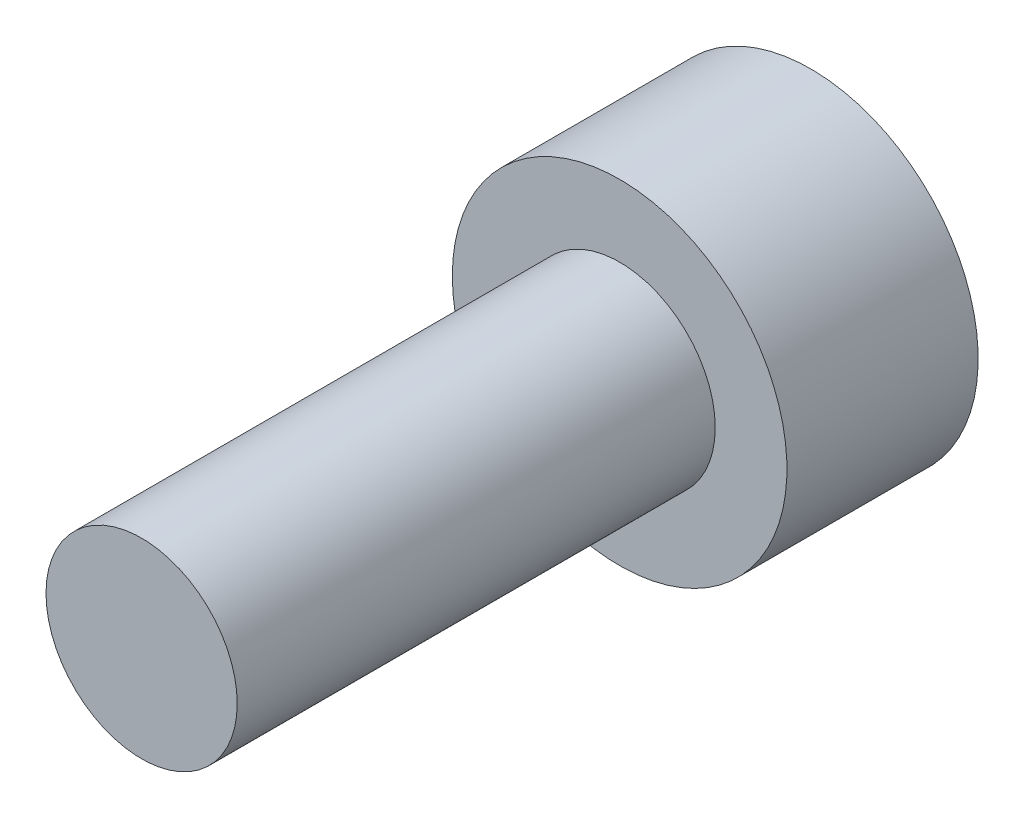
ISO-10303-21;
HEADER;
FILE_DESCRIPTION(('STEP AP214'),'2;1');
FILE_NAME('part.step','',(''),(''),'','','');
FILE_SCHEMA(('AUTOMOTIVE_DESIGN { 1 0 10303 214 1 1 1 1 }'));
ENDSEC;
DATA;
#1=APPLICATION_CONTEXT('core data for automotive mechanical design processes');
#2=APPLICATION_PROTOCOL_DEFINITION('international standard','automotive_design',2000,#1);
#3=PRODUCT_CONTEXT('',#1,'mechanical');
#4=PRODUCT('Part','Part','',(#3));
#5=PRODUCT_RELATED_PRODUCT_CATEGORY('part','',(#4));
#6=PRODUCT_DEFINITION_FORMATION('','',#4);
#7=PRODUCT_DEFINITION_CONTEXT('part definition',#1,'design');
#8=PRODUCT_DEFINITION('design','',#6,#7);
#9=PRODUCT_DEFINITION_SHAPE('','',#8);
#10=(LENGTH_UNIT() NAMED_UNIT(*) SI_UNIT(.MILLI.,.METRE.));
#11=(NAMED_UNIT(*) PLANE_ANGLE_UNIT() SI_UNIT($,.RADIAN.));
#12=(NAMED_UNIT(*) SI_UNIT($,.STERADIAN.) SOLID_ANGLE_UNIT());
#13=UNCERTAINTY_MEASURE_WITH_UNIT(LENGTH_MEASURE(1.E-05),#10,'distance_accuracy_value','');
#14=(GEOMETRIC_REPRESENTATION_CONTEXT(3) GLOBAL_UNCERTAINTY_ASSIGNED_CONTEXT((#13)) GLOBAL_UNIT_ASSIGNED_CONTEXT((#10,
#11,#12)) REPRESENTATION_CONTEXT('',''));
#15=CARTESIAN_POINT('',(0.,0.,0.));
#16=DIRECTION('',(0.,0.,1.));
#17=DIRECTION('',(1.,0.,0.));
#18=AXIS2_PLACEMENT_3D('',#15,#16,#17);
#19=CARTESIAN_POINT('',(0.,0.,0.));
#20=DIRECTION('',(0.,0.,-1.));
#21=DIRECTION('',(-1.,0.,0.));
#22=AXIS2_PLACEMENT_3D('',#19,#20,#21);
#23=PLANE('',#22);
#24=CARTESIAN_POINT('',(0.,0.,0.));
#25=DIRECTION('',(0.,0.,-1.));
#26=DIRECTION('',(-1.,0.,0.));
#27=AXIS2_PLACEMENT_3D('',#24,#25,#26);
#28=CIRCLE('',#27,2.);
#29=CARTESIAN_POINT('',(-2.,0.,0.));
#30=VERTEX_POINT('',#29);
#31=EDGE_CURVE('E11',#30,#30,#28,.T.);
#32=ORIENTED_EDGE('',*,*,#31,.F.);
#33=EDGE_LOOP('',(#32));
#34=FACE_BOUND('',#33,.T.);
#35=ADVANCED_FACE('F38',(#34),#23,.F.);
#36=CARTESIAN_POINT('',(0.,0.,-14.));
#37=DIRECTION('',(0.,0.,-1.));
#38=DIRECTION('',(-1.,0.,0.));
#39=AXIS2_PLACEMENT_3D('',#36,#37,#38);
#40=CYLINDRICAL_SURFACE('',#39,2.);
#41=CARTESIAN_POINT('',(0.,0.,-10.));
#42=DIRECTION('',(0.,0.,-1.));
#43=DIRECTION('',(-1.,0.,0.));
#44=AXIS2_PLACEMENT_3D('',#41,#42,#43);
#45=CIRCLE('',#44,2.);
#46=CARTESIAN_POINT('',(-2.,0.,-10.));
#47=VERTEX_POINT('',#46);
#48=EDGE_CURVE('E45',#47,#47,#45,.T.);
#49=ORIENTED_EDGE('',*,*,#48,.F.);
#50=EDGE_LOOP('',(#49));
#51=FACE_BOUND('',#50,.T.);
#52=ORIENTED_EDGE('',*,*,#31,.T.);
#53=EDGE_LOOP('',(#52));
#54=FACE_BOUND('',#53,.T.);
#55=ADVANCED_FACE('F154',(#51,#54),#40,.T.);
#56=CARTESIAN_POINT('',(2.,0.,-10.));
#57=DIRECTION('',(0.,0.,-1.));
#58=DIRECTION('',(-1.,0.,0.));
#59=AXIS2_PLACEMENT_3D('',#56,#57,#58);
#60=PLANE('',#59);
#61=CARTESIAN_POINT('',(0.,0.,-10.));
#62=DIRECTION('',(0.,0.,-1.));
#63=DIRECTION('',(-1.,0.,0.));
#64=AXIS2_PLACEMENT_3D('',#61,#62,#63);
#65=CIRCLE('',#64,3.5);
#66=CARTESIAN_POINT('',(-3.5,0.,-10.));
#67=VERTEX_POINT('',#66);
#68=EDGE_CURVE('E147',#67,#67,#65,.T.);
#69=ORIENTED_EDGE('',*,*,#68,.F.);
#70=EDGE_LOOP('',(#69));
#71=FACE_BOUND('',#70,.T.);
#72=ORIENTED_EDGE('',*,*,#48,.T.);
#73=EDGE_LOOP('',(#72));
#74=FACE_BOUND('',#73,.T.);
#75=ADVANCED_FACE('F152',(#71,#74),#60,.F.);
#76=CARTESIAN_POINT('',(0.,0.,-14.));
#77=DIRECTION('',(0.,0.,-1.));
#78=DIRECTION('',(-1.,0.,0.));
#79=AXIS2_PLACEMENT_3D('',#76,#77,#78);
#80=CYLINDRICAL_SURFACE('',#79,3.5);
#81=CARTESIAN_POINT('',(0.,0.,-14.));
#82=DIRECTION('',(0.,0.,-1.));
#83=DIRECTION('',(-1.,0.,0.));
#84=AXIS2_PLACEMENT_3D('',#81,#82,#83);
#85=CIRCLE('',#84,3.5);
#86=CARTESIAN_POINT('',(-3.5,0.,-14.));
#87=VERTEX_POINT('',#86);
#88=EDGE_CURVE('E139',#87,#87,#85,.T.);
#89=ORIENTED_EDGE('',*,*,#88,.F.);
#90=EDGE_LOOP('',(#89));
#91=FACE_BOUND('',#90,.T.);
#92=ORIENTED_EDGE('',*,*,#68,.T.);
#93=EDGE_LOOP('',(#92));
#94=FACE_BOUND('',#93,.T.);
#95=ADVANCED_FACE('F172',(#91,#94),#80,.T.);
#96=CARTESIAN_POINT('',(3.5,0.,-14.));
#97=DIRECTION('',(0.,0.,1.));
#98=DIRECTION('',(1.,0.,0.));
#99=AXIS2_PLACEMENT_3D('',#96,#97,#98);
#100=PLANE('',#99);
#101=DIRECTION('',(0.866025403784439,-0.5,0.));
#102=VECTOR('',#101,1.);
#103=CARTESIAN_POINT('',(0.,2.19393102292058,-14.));
#104=LINE('',#103,#102);
#105=CARTESIAN_POINT('',(0.,2.19393102292058,-14.));
#106=VERTEX_POINT('',#105);
#107=CARTESIAN_POINT('',(1.9,1.09696551146029,-14.));
#108=VERTEX_POINT('',#107);
#109=EDGE_CURVE('E126',#106,#108,#104,.T.);
#110=ORIENTED_EDGE('',*,*,#109,.F.);
#111=DIRECTION('',(0.866025403784439,0.5,0.));
#112=VECTOR('',#111,1.);
#113=CARTESIAN_POINT('',(-1.9,1.09696551146029,-14.));
#114=LINE('',#113,#112);
#115=CARTESIAN_POINT('',(-1.9,1.09696551146029,-14.));
#116=VERTEX_POINT('',#115);
#117=EDGE_CURVE('E52',#116,#106,#114,.T.);
#118=ORIENTED_EDGE('',*,*,#117,.F.);
#119=DIRECTION('',(0.,1.,0.));
#120=VECTOR('',#119,1.);
#121=CARTESIAN_POINT('',(-1.9,-1.09696551146029,-14.));
#122=LINE('',#121,#120);
#123=CARTESIAN_POINT('',(-1.9,-1.09696551146029,-14.));
#124=VERTEX_POINT('',#123);
#125=EDGE_CURVE('E135',#124,#116,#122,.T.);
#126=ORIENTED_EDGE('',*,*,#125,.F.);
#127=DIRECTION('',(-0.866025403784439,0.5,0.));
#128=VECTOR('',#127,1.);
#129=CARTESIAN_POINT('',(0.,-2.19393102292058,-14.));
#130=LINE('',#129,#128);
#131=CARTESIAN_POINT('',(0.,-2.19393102292058,-14.));
#132=VERTEX_POINT('',#131);
#133=EDGE_CURVE('E133',#132,#124,#130,.T.);
#134=ORIENTED_EDGE('',*,*,#133,.F.);
#135=DIRECTION('',(-0.866025403784438,-0.5,0.));
#136=VECTOR('',#135,1.);
#137=CARTESIAN_POINT('',(1.9,-1.09696551146029,-14.));
#138=LINE('',#137,#136);
#139=CARTESIAN_POINT('',(1.9,-1.09696551146029,-14.));
#140=VERTEX_POINT('',#139);
#141=EDGE_CURVE('E100',#140,#132,#138,.T.);
#142=ORIENTED_EDGE('',*,*,#141,.F.);
#143=DIRECTION('',(0.,-1.,0.));
#144=VECTOR('',#143,1.);
#145=CARTESIAN_POINT('',(1.9,1.09696551146029,-14.));
#146=LINE('',#145,#144);
#147=EDGE_CURVE('E129',#108,#140,#146,.T.);
#148=ORIENTED_EDGE('',*,*,#147,.F.);
#149=EDGE_LOOP('',(#110,#118,#126,#134,#142,#148));
#150=FACE_BOUND('',#149,.T.);
#151=ORIENTED_EDGE('',*,*,#88,.T.);
#152=EDGE_LOOP('',(#151));
#153=FACE_BOUND('',#152,.T.);
#154=ADVANCED_FACE('F180',(#150,#153),#100,.F.);
#155=CARTESIAN_POINT('',(-1.9,1.09696551146029,-12.));
#156=DIRECTION('',(-0.5,0.866025403784439,0.));
#157=DIRECTION('',(-0.866025403784439,-0.5,0.));
#158=AXIS2_PLACEMENT_3D('',#155,#156,#157);
#159=PLANE('',#158);
#160=ORIENTED_EDGE('',*,*,#117,.T.);
#161=DIRECTION('',(0.,0.,-1.));
#162=VECTOR('',#161,1.);
#163=CARTESIAN_POINT('',(0.,2.19393102292058,-12.));
#164=LINE('',#163,#162);
#165=CARTESIAN_POINT('',(0.,2.19393102292058,-12.));
#166=VERTEX_POINT('',#165);
#167=EDGE_CURVE('E82',#166,#106,#164,.T.);
#168=ORIENTED_EDGE('',*,*,#167,.F.);
#169=DIRECTION('',(0.866025403784439,0.5,0.));
#170=VECTOR('',#169,1.);
#171=CARTESIAN_POINT('',(-1.9,1.09696551146029,-12.));
#172=LINE('',#171,#170);
#173=CARTESIAN_POINT('',(-1.9,1.09696551146029,-12.));
#174=VERTEX_POINT('',#173);
#175=EDGE_CURVE('E137',#174,#166,#172,.T.);
#176=ORIENTED_EDGE('',*,*,#175,.F.);
#177=DIRECTION('',(0.,0.,-1.));
#178=VECTOR('',#177,1.);
#179=CARTESIAN_POINT('',(-1.9,1.09696551146029,-12.));
#180=LINE('',#179,#178);
#181=EDGE_CURVE('E60',#174,#116,#180,.T.);
#182=ORIENTED_EDGE('',*,*,#181,.T.);
#183=EDGE_LOOP('',(#160,#168,#176,#182));
#184=FACE_BOUND('',#183,.T.);
#185=ADVANCED_FACE('F188',(#184),#159,.F.);
#186=CARTESIAN_POINT('',(-1.9,-1.09696551146029,-12.));
#187=DIRECTION('',(-1.,0.,0.));
#188=DIRECTION('',(0.,0.,1.));
#189=AXIS2_PLACEMENT_3D('',#186,#187,#188);
#190=PLANE('',#189);
#191=ORIENTED_EDGE('',*,*,#125,.T.);
#192=ORIENTED_EDGE('',*,*,#181,.F.);
#193=DIRECTION('',(0.,1.,0.));
#194=VECTOR('',#193,1.);
#195=CARTESIAN_POINT('',(-1.9,-1.09696551146029,-12.));
#196=LINE('',#195,#194);
#197=CARTESIAN_POINT('',(-1.9,-1.09696551146029,-12.));
#198=VERTEX_POINT('',#197);
#199=EDGE_CURVE('E112',#198,#174,#196,.T.);
#200=ORIENTED_EDGE('',*,*,#199,.F.);
#201=DIRECTION('',(0.,0.,-1.));
#202=VECTOR('',#201,1.);
#203=CARTESIAN_POINT('',(-1.9,-1.09696551146029,-12.));
#204=LINE('',#203,#202);
#205=EDGE_CURVE('E104',#198,#124,#204,.T.);
#206=ORIENTED_EDGE('',*,*,#205,.T.);
#207=EDGE_LOOP('',(#191,#192,#200,#206));
#208=FACE_BOUND('',#207,.T.);
#209=ADVANCED_FACE('F196',(#208),#190,.F.);
#210=CARTESIAN_POINT('',(0.,-2.19393102292058,-12.));
#211=DIRECTION('',(-0.5,-0.866025403784439,0.));
#212=DIRECTION('',(0.866025403784439,-0.5,0.));
#213=AXIS2_PLACEMENT_3D('',#210,#211,#212);
#214=PLANE('',#213);
#215=ORIENTED_EDGE('',*,*,#133,.T.);
#216=ORIENTED_EDGE('',*,*,#205,.F.);
#217=DIRECTION('',(-0.866025403784439,0.5,0.));
#218=VECTOR('',#217,1.);
#219=CARTESIAN_POINT('',(0.,-2.19393102292058,-12.));
#220=LINE('',#219,#218);
#221=CARTESIAN_POINT('',(0.,-2.19393102292058,-12.));
#222=VERTEX_POINT('',#221);
#223=EDGE_CURVE('E108',#222,#198,#220,.T.);
#224=ORIENTED_EDGE('',*,*,#223,.F.);
#225=DIRECTION('',(0.,0.,-1.));
#226=VECTOR('',#225,1.);
#227=CARTESIAN_POINT('',(0.,-2.19393102292058,-12.));
#228=LINE('',#227,#226);
#229=EDGE_CURVE('E93',#222,#132,#228,.T.);
#230=ORIENTED_EDGE('',*,*,#229,.T.);
#231=EDGE_LOOP('',(#215,#216,#224,#230));
#232=FACE_BOUND('',#231,.T.);
#233=ADVANCED_FACE('F109',(#232),#214,.F.);
#234=CARTESIAN_POINT('',(1.9,-1.09696551146029,-12.));
#235=DIRECTION('',(0.5,-0.866025403784439,0.));
#236=DIRECTION('',(0.866025403784438,0.5,0.));
#237=AXIS2_PLACEMENT_3D('',#234,#235,#236);
#238=PLANE('',#237);
#239=ORIENTED_EDGE('',*,*,#141,.T.);
#240=ORIENTED_EDGE('',*,*,#229,.F.);
#241=DIRECTION('',(-0.866025403784438,-0.5,0.));
#242=VECTOR('',#241,1.);
#243=CARTESIAN_POINT('',(1.9,-1.09696551146029,-12.));
#244=LINE('',#243,#242);
#245=CARTESIAN_POINT('',(1.9,-1.09696551146029,-12.));
#246=VERTEX_POINT('',#245);
#247=EDGE_CURVE('E97',#246,#222,#244,.T.);
#248=ORIENTED_EDGE('',*,*,#247,.F.);
#249=DIRECTION('',(0.,0.,-1.));
#250=VECTOR('',#249,1.);
#251=CARTESIAN_POINT('',(1.9,-1.09696551146029,-12.));
#252=LINE('',#251,#250);
#253=EDGE_CURVE('E105',#246,#140,#252,.T.);
#254=ORIENTED_EDGE('',*,*,#253,.T.);
#255=EDGE_LOOP('',(#239,#240,#248,#254));
#256=FACE_BOUND('',#255,.T.);
#257=ADVANCED_FACE('F95',(#256),#238,.F.);
#258=CARTESIAN_POINT('',(1.9,1.09696551146029,-12.));
#259=DIRECTION('',(1.,0.,0.));
#260=DIRECTION('',(0.,1.,0.));
#261=AXIS2_PLACEMENT_3D('',#258,#259,#260);
#262=PLANE('',#261);
#263=ORIENTED_EDGE('',*,*,#147,.T.);
#264=ORIENTED_EDGE('',*,*,#253,.F.);
#265=DIRECTION('',(0.,-1.,0.));
#266=VECTOR('',#265,1.);
#267=CARTESIAN_POINT('',(1.9,1.09696551146029,-12.));
#268=LINE('',#267,#266);
#269=CARTESIAN_POINT('',(1.9,1.09696551146029,-12.));
#270=VERTEX_POINT('',#269);
#271=EDGE_CURVE('E118',#270,#246,#268,.T.);
#272=ORIENTED_EDGE('',*,*,#271,.F.);
#273=DIRECTION('',(0.,0.,-1.));
#274=VECTOR('',#273,1.);
#275=CARTESIAN_POINT('',(1.9,1.09696551146029,-12.));
#276=LINE('',#275,#274);
#277=EDGE_CURVE('E142',#270,#108,#276,.T.);
#278=ORIENTED_EDGE('',*,*,#277,.T.);
#279=EDGE_LOOP('',(#263,#264,#272,#278));
#280=FACE_BOUND('',#279,.T.);
#281=ADVANCED_FACE('F215',(#280),#262,.F.);
#282=CARTESIAN_POINT('',(0.,2.19393102292058,-12.));
#283=DIRECTION('',(0.5,0.866025403784439,0.));
#284=DIRECTION('',(-0.866025403784439,0.5,0.));
#285=AXIS2_PLACEMENT_3D('',#282,#283,#284);
#286=PLANE('',#285);
#287=ORIENTED_EDGE('',*,*,#109,.T.);
#288=ORIENTED_EDGE('',*,*,#277,.F.);
#289=DIRECTION('',(0.866025403784439,-0.5,0.));
#290=VECTOR('',#289,1.);
#291=CARTESIAN_POINT('',(0.,2.19393102292058,-12.));
#292=LINE('',#291,#290);
#293=EDGE_CURVE('E120',#166,#270,#292,.T.);
#294=ORIENTED_EDGE('',*,*,#293,.F.);
#295=ORIENTED_EDGE('',*,*,#167,.T.);
#296=EDGE_LOOP('',(#287,#288,#294,#295));
#297=FACE_BOUND('',#296,.T.);
#298=ADVANCED_FACE('F222',(#297),#286,.F.);
#299=CARTESIAN_POINT('',(0.,0.,-12.));
#300=DIRECTION('',(0.,0.,-1.));
#301=DIRECTION('',(-1.,0.,0.));
#302=AXIS2_PLACEMENT_3D('',#299,#300,#301);
#303=PLANE('',#302);
#304=ORIENTED_EDGE('',*,*,#175,.T.);
#305=ORIENTED_EDGE('',*,*,#293,.T.);
#306=ORIENTED_EDGE('',*,*,#271,.T.);
#307=ORIENTED_EDGE('',*,*,#247,.T.);
#308=ORIENTED_EDGE('',*,*,#223,.T.);
#309=ORIENTED_EDGE('',*,*,#199,.T.);
#310=EDGE_LOOP('',(#304,#305,#306,#307,#308,#309));
#311=FACE_BOUND('',#310,.T.);
#312=ADVANCED_FACE('F115',(#311),#303,.T.);
#313=CLOSED_SHELL('',(#35,#55,#75,#95,#154,#185,#209,#233,#257,#281,#298,#312));
#314=MANIFOLD_SOLID_BREP('B2',#313);
#315=ADVANCED_BREP_SHAPE_REPRESENTATION('',(#18,#314),#14);
#316=SHAPE_DEFINITION_REPRESENTATION(#9,#315);
ENDSEC;
END-ISO-10303-21;
